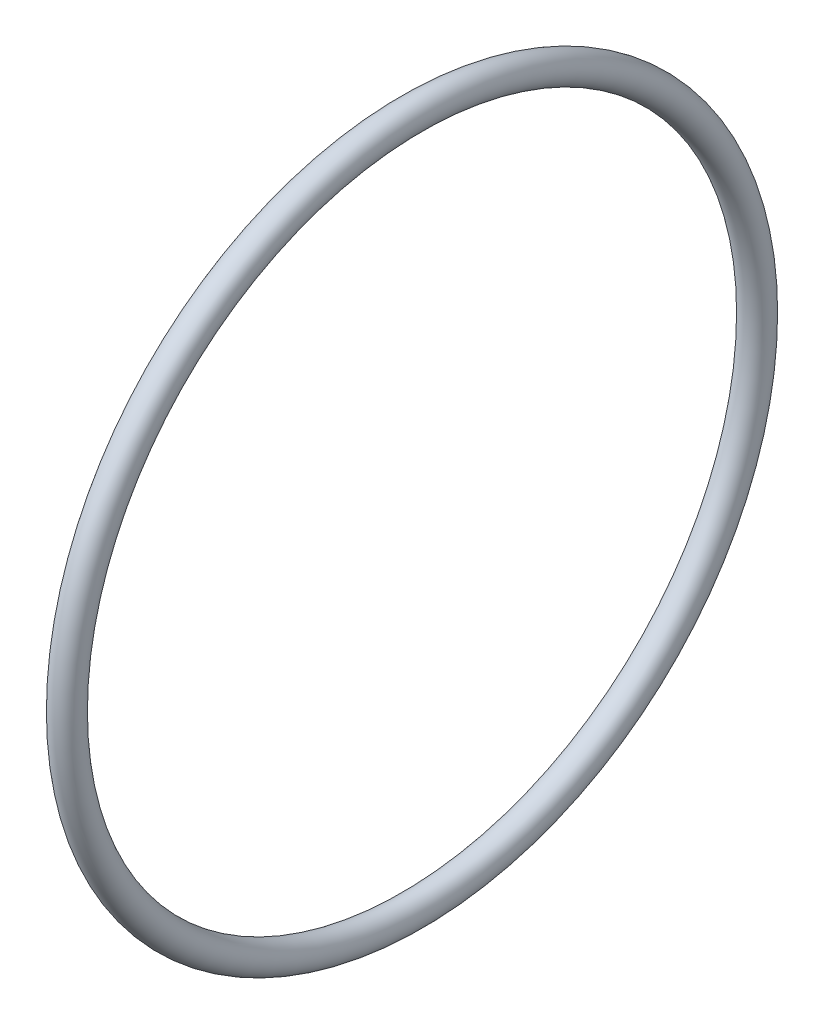
ISO-10303-21;
HEADER;
FILE_DESCRIPTION(('STEP AP214'),'2;1');
FILE_NAME('part.step','',(''),(''),'','','');
FILE_SCHEMA(('AUTOMOTIVE_DESIGN { 1 0 10303 214 1 1 1 1 }'));
ENDSEC;
DATA;
#1=APPLICATION_CONTEXT('core data for automotive mechanical design processes');
#2=APPLICATION_PROTOCOL_DEFINITION('international standard','automotive_design',2000,#1);
#3=PRODUCT_CONTEXT('',#1,'mechanical');
#4=PRODUCT('Part','Part','',(#3));
#5=PRODUCT_RELATED_PRODUCT_CATEGORY('part','',(#4));
#6=PRODUCT_DEFINITION_FORMATION('','',#4);
#7=PRODUCT_DEFINITION_CONTEXT('part definition',#1,'design');
#8=PRODUCT_DEFINITION('design','',#6,#7);
#9=PRODUCT_DEFINITION_SHAPE('','',#8);
#10=(LENGTH_UNIT() NAMED_UNIT(*) SI_UNIT(.MILLI.,.METRE.));
#11=(NAMED_UNIT(*) PLANE_ANGLE_UNIT() SI_UNIT($,.RADIAN.));
#12=(NAMED_UNIT(*) SI_UNIT($,.STERADIAN.) SOLID_ANGLE_UNIT());
#13=UNCERTAINTY_MEASURE_WITH_UNIT(LENGTH_MEASURE(1.E-05),#10,'distance_accuracy_value','');
#14=(GEOMETRIC_REPRESENTATION_CONTEXT(3) GLOBAL_UNCERTAINTY_ASSIGNED_CONTEXT((#13)) GLOBAL_UNIT_ASSIGNED_CONTEXT((#10,
#11,#12)) REPRESENTATION_CONTEXT('',''));
#15=CARTESIAN_POINT('',(0.,0.,0.));
#16=DIRECTION('',(0.,0.,1.));
#17=DIRECTION('',(1.,0.,0.));
#18=AXIS2_PLACEMENT_3D('',#15,#16,#17);
#19=CARTESIAN_POINT('',(0.,0.,0.));
#20=DIRECTION('',(-1.,0.,0.));
#21=DIRECTION('',(0.,0.,1.));
#22=AXIS2_PLACEMENT_3D('',#19,#20,#21);
#23=TOROIDAL_SURFACE('',#22,21.4,0.900000000000001);
#24=CARTESIAN_POINT('',(0.,0.,22.3));
#25=VERTEX_POINT('',#24);
#26=VERTEX_LOOP('',#25);
#27=FACE_BOUND('',#26,.T.);
#28=ADVANCED_FACE('F36',(#27),#23,.T.);
#29=CLOSED_SHELL('',(#28));
#30=MANIFOLD_SOLID_BREP('B2',#29);
#31=ADVANCED_BREP_SHAPE_REPRESENTATION('',(#18,#30),#14);
#32=SHAPE_DEFINITION_REPRESENTATION(#9,#31);
ENDSEC;
END-ISO-10303-21;
